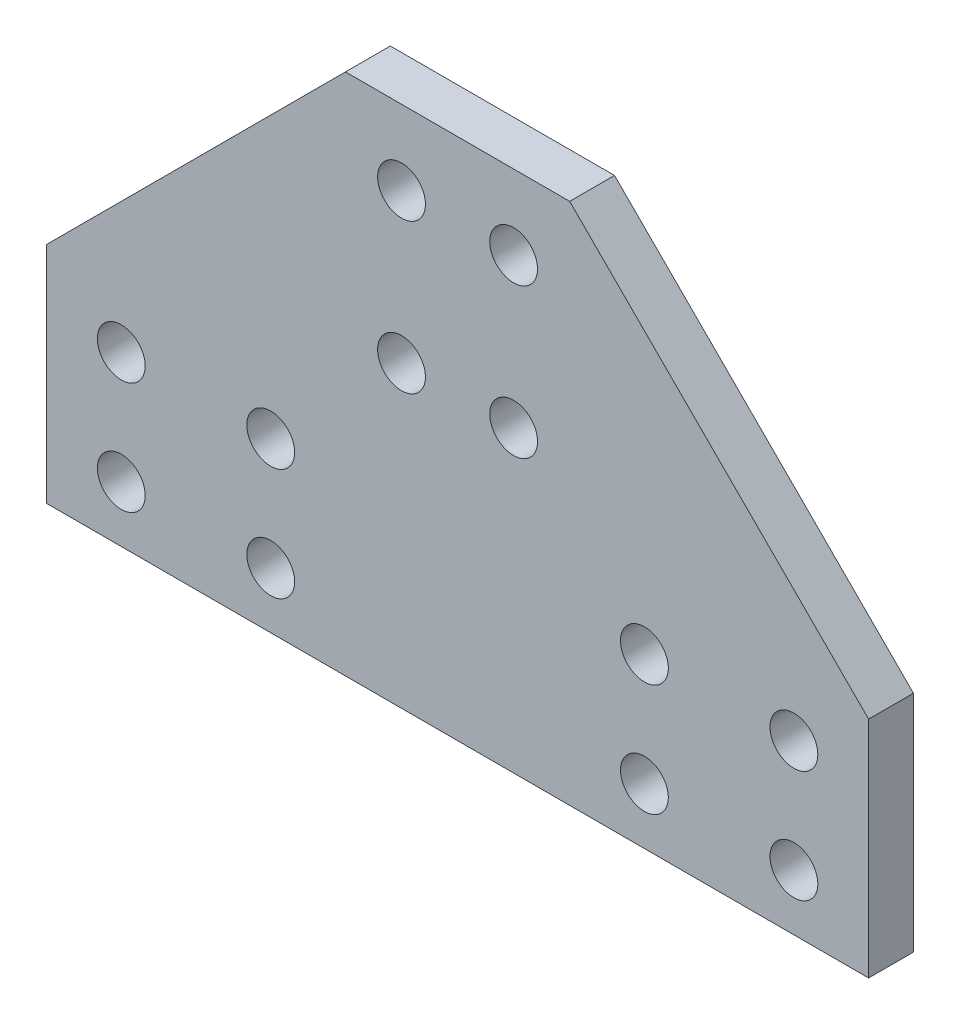
ISO-10303-21;
HEADER;
FILE_DESCRIPTION(('STEP AP214'),'2;1');
FILE_NAME('part.step','',(''),(''),'','','');
FILE_SCHEMA(('AUTOMOTIVE_DESIGN { 1 0 10303 214 1 1 1 1 }'));
ENDSEC;
DATA;
#1=APPLICATION_CONTEXT('core data for automotive mechanical design processes');
#2=APPLICATION_PROTOCOL_DEFINITION('international standard','automotive_design',2000,#1);
#3=PRODUCT_CONTEXT('',#1,'mechanical');
#4=PRODUCT('Part','Part','',(#3));
#5=PRODUCT_RELATED_PRODUCT_CATEGORY('part','',(#4));
#6=PRODUCT_DEFINITION_FORMATION('','',#4);
#7=PRODUCT_DEFINITION_CONTEXT('part definition',#1,'design');
#8=PRODUCT_DEFINITION('design','',#6,#7);
#9=PRODUCT_DEFINITION_SHAPE('','',#8);
#10=(LENGTH_UNIT() NAMED_UNIT(*) SI_UNIT(.MILLI.,.METRE.));
#11=(NAMED_UNIT(*) PLANE_ANGLE_UNIT() SI_UNIT($,.RADIAN.));
#12=(NAMED_UNIT(*) SI_UNIT($,.STERADIAN.) SOLID_ANGLE_UNIT());
#13=UNCERTAINTY_MEASURE_WITH_UNIT(LENGTH_MEASURE(1.E-05),#10,'distance_accuracy_value','');
#14=(GEOMETRIC_REPRESENTATION_CONTEXT(3) GLOBAL_UNCERTAINTY_ASSIGNED_CONTEXT((#13)) GLOBAL_UNIT_ASSIGNED_CONTEXT((#10,
#11,#12)) REPRESENTATION_CONTEXT('',''));
#15=CARTESIAN_POINT('',(0.,0.,0.));
#16=DIRECTION('',(0.,0.,1.));
#17=DIRECTION('',(1.,0.,0.));
#18=AXIS2_PLACEMENT_3D('',#15,#16,#17);
#19=CARTESIAN_POINT('',(-20.,-20.,3.));
#20=DIRECTION('',(0.707106781186548,-0.707106781186547,0.));
#21=DIRECTION('',(0.707106781186547,0.707106781186548,0.));
#22=AXIS2_PLACEMENT_3D('',#19,#20,#21);
#23=PLANE('',#22);
#24=DIRECTION('',(-0.707106781186547,-0.707106781186548,0.));
#25=VECTOR('',#24,1.);
#26=CARTESIAN_POINT('',(-20.,-20.,0.));
#27=LINE('',#26,#25);
#28=CARTESIAN_POINT('',(0.,0.,0.));
#29=VERTEX_POINT('',#28);
#30=CARTESIAN_POINT('',(-20.,-20.,0.));
#31=VERTEX_POINT('',#30);
#32=EDGE_CURVE('E132',#29,#31,#27,.T.);
#33=ORIENTED_EDGE('',*,*,#32,.T.);
#34=DIRECTION('',(0.,0.,-1.));
#35=VECTOR('',#34,1.);
#36=CARTESIAN_POINT('',(-20.,-20.,3.));
#37=LINE('',#36,#35);
#38=CARTESIAN_POINT('',(-20.,-20.,3.));
#39=VERTEX_POINT('',#38);
#40=EDGE_CURVE('E11',#39,#31,#37,.T.);
#41=ORIENTED_EDGE('',*,*,#40,.F.);
#42=DIRECTION('',(-0.707106781186547,-0.707106781186548,0.));
#43=VECTOR('',#42,1.);
#44=CARTESIAN_POINT('',(-20.,-20.,3.));
#45=LINE('',#44,#43);
#46=CARTESIAN_POINT('',(0.,0.,3.));
#47=VERTEX_POINT('',#46);
#48=EDGE_CURVE('E149',#47,#39,#45,.T.);
#49=ORIENTED_EDGE('',*,*,#48,.F.);
#50=DIRECTION('',(0.,0.,-1.));
#51=VECTOR('',#50,1.);
#52=CARTESIAN_POINT('',(0.,0.,3.));
#53=LINE('',#52,#51);
#54=EDGE_CURVE('E128',#47,#29,#53,.T.);
#55=ORIENTED_EDGE('',*,*,#54,.T.);
#56=EDGE_LOOP('',(#33,#41,#49,#55));
#57=FACE_BOUND('',#56,.T.);
#58=ADVANCED_FACE('F43',(#57),#23,.F.);
#59=CARTESIAN_POINT('',(-20.,-35.,3.));
#60=DIRECTION('',(1.,0.,0.));
#61=DIRECTION('',(0.,0.,-1.));
#62=AXIS2_PLACEMENT_3D('',#59,#60,#61);
#63=PLANE('',#62);
#64=DIRECTION('',(0.,-1.,0.));
#65=VECTOR('',#64,1.);
#66=CARTESIAN_POINT('',(-20.,-35.,0.));
#67=LINE('',#66,#65);
#68=CARTESIAN_POINT('',(-20.,-35.,0.));
#69=VERTEX_POINT('',#68);
#70=EDGE_CURVE('E136',#31,#69,#67,.T.);
#71=ORIENTED_EDGE('',*,*,#70,.T.);
#72=DIRECTION('',(0.,0.,-1.));
#73=VECTOR('',#72,1.);
#74=CARTESIAN_POINT('',(-20.,-35.,3.));
#75=LINE('',#74,#73);
#76=CARTESIAN_POINT('',(-20.,-35.,3.));
#77=VERTEX_POINT('',#76);
#78=EDGE_CURVE('E52',#77,#69,#75,.T.);
#79=ORIENTED_EDGE('',*,*,#78,.F.);
#80=DIRECTION('',(0.,-1.,0.));
#81=VECTOR('',#80,1.);
#82=CARTESIAN_POINT('',(-20.,-35.,3.));
#83=LINE('',#82,#81);
#84=EDGE_CURVE('E97',#39,#77,#83,.T.);
#85=ORIENTED_EDGE('',*,*,#84,.F.);
#86=ORIENTED_EDGE('',*,*,#40,.T.);
#87=EDGE_LOOP('',(#71,#79,#85,#86));
#88=FACE_BOUND('',#87,.T.);
#89=ADVANCED_FACE('F178',(#88),#63,.F.);
#90=CARTESIAN_POINT('',(35.,-35.,3.));
#91=DIRECTION('',(0.,1.,0.));
#92=DIRECTION('',(-1.,0.,0.));
#93=AXIS2_PLACEMENT_3D('',#90,#91,#92);
#94=PLANE('',#93);
#95=DIRECTION('',(1.,0.,0.));
#96=VECTOR('',#95,1.);
#97=CARTESIAN_POINT('',(35.,-35.,0.));
#98=LINE('',#97,#96);
#99=CARTESIAN_POINT('',(35.,-35.,0.));
#100=VERTEX_POINT('',#99);
#101=EDGE_CURVE('E140',#69,#100,#98,.T.);
#102=ORIENTED_EDGE('',*,*,#101,.T.);
#103=DIRECTION('',(0.,0.,-1.));
#104=VECTOR('',#103,1.);
#105=CARTESIAN_POINT('',(35.,-35.,3.));
#106=LINE('',#105,#104);
#107=CARTESIAN_POINT('',(35.,-35.,3.));
#108=VERTEX_POINT('',#107);
#109=EDGE_CURVE('E121',#108,#100,#106,.T.);
#110=ORIENTED_EDGE('',*,*,#109,.F.);
#111=DIRECTION('',(1.,0.,0.));
#112=VECTOR('',#111,1.);
#113=CARTESIAN_POINT('',(35.,-35.,3.));
#114=LINE('',#113,#112);
#115=EDGE_CURVE('E110',#77,#108,#114,.T.);
#116=ORIENTED_EDGE('',*,*,#115,.F.);
#117=ORIENTED_EDGE('',*,*,#78,.T.);
#118=EDGE_LOOP('',(#102,#110,#116,#117));
#119=FACE_BOUND('',#118,.T.);
#120=ADVANCED_FACE('F159',(#119),#94,.F.);
#121=CARTESIAN_POINT('',(35.,-20.,3.));
#122=DIRECTION('',(-1.,0.,0.));
#123=DIRECTION('',(0.,0.,1.));
#124=AXIS2_PLACEMENT_3D('',#121,#122,#123);
#125=PLANE('',#124);
#126=DIRECTION('',(0.,1.,0.));
#127=VECTOR('',#126,1.);
#128=CARTESIAN_POINT('',(35.,-20.,0.));
#129=LINE('',#128,#127);
#130=CARTESIAN_POINT('',(35.,-20.,0.));
#131=VERTEX_POINT('',#130);
#132=EDGE_CURVE('E119',#100,#131,#129,.T.);
#133=ORIENTED_EDGE('',*,*,#132,.T.);
#134=DIRECTION('',(0.,0.,-1.));
#135=VECTOR('',#134,1.);
#136=CARTESIAN_POINT('',(35.,-20.,3.));
#137=LINE('',#136,#135);
#138=CARTESIAN_POINT('',(35.,-20.,3.));
#139=VERTEX_POINT('',#138);
#140=EDGE_CURVE('E116',#139,#131,#137,.T.);
#141=ORIENTED_EDGE('',*,*,#140,.F.);
#142=DIRECTION('',(0.,1.,0.));
#143=VECTOR('',#142,1.);
#144=CARTESIAN_POINT('',(35.,-20.,3.));
#145=LINE('',#144,#143);
#146=EDGE_CURVE('E104',#108,#139,#145,.T.);
#147=ORIENTED_EDGE('',*,*,#146,.F.);
#148=ORIENTED_EDGE('',*,*,#109,.T.);
#149=EDGE_LOOP('',(#133,#141,#147,#148));
#150=FACE_BOUND('',#149,.T.);
#151=ADVANCED_FACE('F117',(#150),#125,.F.);
#152=CARTESIAN_POINT('',(15.,0.,3.));
#153=DIRECTION('',(-0.707106781186547,-0.707106781186548,0.));
#154=DIRECTION('',(0.707106781186548,-0.707106781186547,0.));
#155=AXIS2_PLACEMENT_3D('',#152,#153,#154);
#156=PLANE('',#155);
#157=DIRECTION('',(-0.707106781186548,0.707106781186547,0.));
#158=VECTOR('',#157,1.);
#159=CARTESIAN_POINT('',(15.,0.,0.));
#160=LINE('',#159,#158);
#161=CARTESIAN_POINT('',(15.,0.,0.));
#162=VERTEX_POINT('',#161);
#163=EDGE_CURVE('E83',#131,#162,#160,.T.);
#164=ORIENTED_EDGE('',*,*,#163,.T.);
#165=DIRECTION('',(0.,0.,-1.));
#166=VECTOR('',#165,1.);
#167=CARTESIAN_POINT('',(15.,0.,3.));
#168=LINE('',#167,#166);
#169=CARTESIAN_POINT('',(15.,0.,3.));
#170=VERTEX_POINT('',#169);
#171=EDGE_CURVE('E122',#170,#162,#168,.T.);
#172=ORIENTED_EDGE('',*,*,#171,.F.);
#173=DIRECTION('',(-0.707106781186548,0.707106781186547,0.));
#174=VECTOR('',#173,1.);
#175=CARTESIAN_POINT('',(15.,0.,3.));
#176=LINE('',#175,#174);
#177=EDGE_CURVE('E108',#139,#170,#176,.T.);
#178=ORIENTED_EDGE('',*,*,#177,.F.);
#179=ORIENTED_EDGE('',*,*,#140,.T.);
#180=EDGE_LOOP('',(#164,#172,#178,#179));
#181=FACE_BOUND('',#180,.T.);
#182=ADVANCED_FACE('F124',(#181),#156,.F.);
#183=CARTESIAN_POINT('',(0.,0.,3.));
#184=DIRECTION('',(0.,-1.,0.));
#185=DIRECTION('',(1.,0.,0.));
#186=AXIS2_PLACEMENT_3D('',#183,#184,#185);
#187=PLANE('',#186);
#188=DIRECTION('',(-1.,0.,0.));
#189=VECTOR('',#188,1.);
#190=CARTESIAN_POINT('',(0.,0.,0.));
#191=LINE('',#190,#189);
#192=EDGE_CURVE('E89',#162,#29,#191,.T.);
#193=ORIENTED_EDGE('',*,*,#192,.T.);
#194=ORIENTED_EDGE('',*,*,#54,.F.);
#195=DIRECTION('',(-1.,0.,0.));
#196=VECTOR('',#195,1.);
#197=CARTESIAN_POINT('',(0.,0.,3.));
#198=LINE('',#197,#196);
#199=EDGE_CURVE('E60',#170,#47,#198,.T.);
#200=ORIENTED_EDGE('',*,*,#199,.F.);
#201=ORIENTED_EDGE('',*,*,#171,.T.);
#202=EDGE_LOOP('',(#193,#194,#200,#201));
#203=FACE_BOUND('',#202,.T.);
#204=ADVANCED_FACE('F166',(#203),#187,.F.);
#205=CARTESIAN_POINT('',(0.,0.,3.));
#206=DIRECTION('',(0.,0.,-1.));
#207=DIRECTION('',(-1.,0.,0.));
#208=AXIS2_PLACEMENT_3D('',#205,#206,#207);
#209=PLANE('',#208);
#210=CARTESIAN_POINT('',(30.,-31.25,3.));
#211=DIRECTION('',(0.,0.,1.));
#212=DIRECTION('',(-1.,0.,0.));
#213=AXIS2_PLACEMENT_3D('',#210,#211,#212);
#214=CIRCLE('',#213,1.6);
#215=CARTESIAN_POINT('',(28.4,-31.25,3.));
#216=VERTEX_POINT('',#215);
#217=EDGE_CURVE('E398',#216,#216,#214,.T.);
#218=ORIENTED_EDGE('',*,*,#217,.F.);
#219=EDGE_LOOP('',(#218));
#220=FACE_BOUND('',#219,.T.);
#221=CARTESIAN_POINT('',(20.,-23.75,3.));
#222=DIRECTION('',(0.,0.,1.));
#223=DIRECTION('',(-1.,0.,0.));
#224=AXIS2_PLACEMENT_3D('',#221,#222,#223);
#225=CIRCLE('',#224,1.6);
#226=CARTESIAN_POINT('',(18.4,-23.75,3.));
#227=VERTEX_POINT('',#226);
#228=EDGE_CURVE('E407',#227,#227,#225,.T.);
#229=ORIENTED_EDGE('',*,*,#228,.F.);
#230=EDGE_LOOP('',(#229));
#231=FACE_BOUND('',#230,.T.);
#232=CARTESIAN_POINT('',(30.,-23.75,3.));
#233=DIRECTION('',(0.,0.,1.));
#234=DIRECTION('',(1.,0.,0.));
#235=AXIS2_PLACEMENT_3D('',#232,#233,#234);
#236=CIRCLE('',#235,1.6);
#237=CARTESIAN_POINT('',(31.6,-23.75,3.));
#238=VERTEX_POINT('',#237);
#239=EDGE_CURVE('E420',#238,#238,#236,.T.);
#240=ORIENTED_EDGE('',*,*,#239,.F.);
#241=EDGE_LOOP('',(#240));
#242=FACE_BOUND('',#241,.T.);
#243=CARTESIAN_POINT('',(3.75,-5.,3.));
#244=DIRECTION('',(0.,0.,1.));
#245=DIRECTION('',(1.,0.,0.));
#246=AXIS2_PLACEMENT_3D('',#243,#244,#245);
#247=CIRCLE('',#246,1.6);
#248=CARTESIAN_POINT('',(5.35,-5.,3.));
#249=VERTEX_POINT('',#248);
#250=EDGE_CURVE('E505',#249,#249,#247,.T.);
#251=ORIENTED_EDGE('',*,*,#250,.F.);
#252=EDGE_LOOP('',(#251));
#253=FACE_BOUND('',#252,.T.);
#254=CARTESIAN_POINT('',(-15.,-23.75,3.));
#255=DIRECTION('',(0.,0.,1.));
#256=DIRECTION('',(-1.,0.,0.));
#257=AXIS2_PLACEMENT_3D('',#254,#255,#256);
#258=CIRCLE('',#257,1.6);
#259=CARTESIAN_POINT('',(-16.6,-23.75,3.));
#260=VERTEX_POINT('',#259);
#261=EDGE_CURVE('E433',#260,#260,#258,.T.);
#262=ORIENTED_EDGE('',*,*,#261,.F.);
#263=EDGE_LOOP('',(#262));
#264=FACE_BOUND('',#263,.T.);
#265=CARTESIAN_POINT('',(-4.99999999999999,-31.25,3.));
#266=DIRECTION('',(0.,0.,1.));
#267=DIRECTION('',(-1.,0.,0.));
#268=AXIS2_PLACEMENT_3D('',#265,#266,#267);
#269=CIRCLE('',#268,1.6);
#270=CARTESIAN_POINT('',(-6.59999999999999,-31.25,3.));
#271=VERTEX_POINT('',#270);
#272=EDGE_CURVE('E442',#271,#271,#269,.T.);
#273=ORIENTED_EDGE('',*,*,#272,.F.);
#274=EDGE_LOOP('',(#273));
#275=FACE_BOUND('',#274,.T.);
#276=CARTESIAN_POINT('',(-5.,-23.75,3.));
#277=DIRECTION('',(0.,0.,1.));
#278=DIRECTION('',(1.,0.,0.));
#279=AXIS2_PLACEMENT_3D('',#276,#277,#278);
#280=CIRCLE('',#279,1.6);
#281=CARTESIAN_POINT('',(-3.4,-23.75,3.));
#282=VERTEX_POINT('',#281);
#283=EDGE_CURVE('E421',#282,#282,#280,.T.);
#284=ORIENTED_EDGE('',*,*,#283,.F.);
#285=EDGE_LOOP('',(#284));
#286=FACE_BOUND('',#285,.T.);
#287=CARTESIAN_POINT('',(20.,-31.25,3.));
#288=DIRECTION('',(0.,0.,1.));
#289=DIRECTION('',(1.,0.,0.));
#290=AXIS2_PLACEMENT_3D('',#287,#288,#289);
#291=CIRCLE('',#290,1.59999999999999);
#292=CARTESIAN_POINT('',(21.6,-31.25,3.));
#293=VERTEX_POINT('',#292);
#294=EDGE_CURVE('E405',#293,#293,#291,.T.);
#295=ORIENTED_EDGE('',*,*,#294,.F.);
#296=EDGE_LOOP('',(#295));
#297=FACE_BOUND('',#296,.T.);
#298=CARTESIAN_POINT('',(11.25,-5.,3.));
#299=DIRECTION('',(0.,0.,1.));
#300=DIRECTION('',(-1.,0.,0.));
#301=AXIS2_PLACEMENT_3D('',#298,#299,#300);
#302=CIRCLE('',#301,1.6);
#303=CARTESIAN_POINT('',(9.65,-5.,3.));
#304=VERTEX_POINT('',#303);
#305=EDGE_CURVE('E478',#304,#304,#302,.T.);
#306=ORIENTED_EDGE('',*,*,#305,.F.);
#307=EDGE_LOOP('',(#306));
#308=FACE_BOUND('',#307,.T.);
#309=CARTESIAN_POINT('',(11.25,-15.,3.));
#310=DIRECTION('',(0.,0.,1.));
#311=DIRECTION('',(1.,0.,0.));
#312=AXIS2_PLACEMENT_3D('',#309,#310,#311);
#313=CIRCLE('',#312,1.6);
#314=CARTESIAN_POINT('',(12.85,-15.,3.));
#315=VERTEX_POINT('',#314);
#316=EDGE_CURVE('E482',#315,#315,#313,.T.);
#317=ORIENTED_EDGE('',*,*,#316,.F.);
#318=EDGE_LOOP('',(#317));
#319=FACE_BOUND('',#318,.T.);
#320=CARTESIAN_POINT('',(3.75,-15.,3.));
#321=DIRECTION('',(0.,0.,1.));
#322=DIRECTION('',(-1.,0.,0.));
#323=AXIS2_PLACEMENT_3D('',#320,#321,#322);
#324=CIRCLE('',#323,1.6);
#325=CARTESIAN_POINT('',(2.15,-15.,3.));
#326=VERTEX_POINT('',#325);
#327=EDGE_CURVE('E485',#326,#326,#324,.T.);
#328=ORIENTED_EDGE('',*,*,#327,.F.);
#329=EDGE_LOOP('',(#328));
#330=FACE_BOUND('',#329,.T.);
#331=CARTESIAN_POINT('',(-15.,-31.25,3.));
#332=DIRECTION('',(0.,0.,1.));
#333=DIRECTION('',(1.,0.,0.));
#334=AXIS2_PLACEMENT_3D('',#331,#332,#333);
#335=CIRCLE('',#334,1.6);
#336=CARTESIAN_POINT('',(-13.4,-31.25,3.));
#337=VERTEX_POINT('',#336);
#338=EDGE_CURVE('E437',#337,#337,#335,.T.);
#339=ORIENTED_EDGE('',*,*,#338,.F.);
#340=EDGE_LOOP('',(#339));
#341=FACE_BOUND('',#340,.T.);
#342=ORIENTED_EDGE('',*,*,#48,.T.);
#343=ORIENTED_EDGE('',*,*,#84,.T.);
#344=ORIENTED_EDGE('',*,*,#115,.T.);
#345=ORIENTED_EDGE('',*,*,#146,.T.);
#346=ORIENTED_EDGE('',*,*,#177,.T.);
#347=ORIENTED_EDGE('',*,*,#199,.T.);
#348=EDGE_LOOP('',(#342,#343,#344,#345,#346,#347));
#349=FACE_BOUND('',#348,.T.);
#350=ADVANCED_FACE('F106',(#220,#231,#242,#253,#264,#275,#286,#297,#308,#319,#330,#341,#349),
#209,.F.);
#351=CARTESIAN_POINT('',(0.,0.,0.));
#352=DIRECTION('',(0.,0.,-1.));
#353=DIRECTION('',(-1.,0.,0.));
#354=AXIS2_PLACEMENT_3D('',#351,#352,#353);
#355=PLANE('',#354);
#356=CARTESIAN_POINT('',(30.,-31.25,0.));
#357=DIRECTION('',(0.,0.,1.));
#358=DIRECTION('',(-1.,0.,0.));
#359=AXIS2_PLACEMENT_3D('',#356,#357,#358);
#360=CIRCLE('',#359,1.6);
#361=CARTESIAN_POINT('',(28.4,-31.25,0.));
#362=VERTEX_POINT('',#361);
#363=EDGE_CURVE('E395',#362,#362,#360,.T.);
#364=ORIENTED_EDGE('',*,*,#363,.T.);
#365=EDGE_LOOP('',(#364));
#366=FACE_BOUND('',#365,.T.);
#367=CARTESIAN_POINT('',(20.,-23.75,0.));
#368=DIRECTION('',(0.,0.,1.));
#369=DIRECTION('',(-1.,0.,0.));
#370=AXIS2_PLACEMENT_3D('',#367,#368,#369);
#371=CIRCLE('',#370,1.6);
#372=CARTESIAN_POINT('',(18.4,-23.75,0.));
#373=VERTEX_POINT('',#372);
#374=EDGE_CURVE('E416',#373,#373,#371,.T.);
#375=ORIENTED_EDGE('',*,*,#374,.T.);
#376=EDGE_LOOP('',(#375));
#377=FACE_BOUND('',#376,.T.);
#378=CARTESIAN_POINT('',(30.,-23.75,0.));
#379=DIRECTION('',(0.,0.,1.));
#380=DIRECTION('',(1.,0.,0.));
#381=AXIS2_PLACEMENT_3D('',#378,#379,#380);
#382=CIRCLE('',#381,1.6);
#383=CARTESIAN_POINT('',(31.6,-23.75,0.));
#384=VERTEX_POINT('',#383);
#385=EDGE_CURVE('E502',#384,#384,#382,.T.);
#386=ORIENTED_EDGE('',*,*,#385,.T.);
#387=EDGE_LOOP('',(#386));
#388=FACE_BOUND('',#387,.T.);
#389=CARTESIAN_POINT('',(3.75,-5.,0.));
#390=DIRECTION('',(0.,0.,1.));
#391=DIRECTION('',(1.,0.,0.));
#392=AXIS2_PLACEMENT_3D('',#389,#390,#391);
#393=CIRCLE('',#392,1.6);
#394=CARTESIAN_POINT('',(5.35,-5.,0.));
#395=VERTEX_POINT('',#394);
#396=EDGE_CURVE('E410',#395,#395,#393,.T.);
#397=ORIENTED_EDGE('',*,*,#396,.T.);
#398=EDGE_LOOP('',(#397));
#399=FACE_BOUND('',#398,.T.);
#400=CARTESIAN_POINT('',(-15.,-23.75,0.));
#401=DIRECTION('',(0.,0.,1.));
#402=DIRECTION('',(-1.,0.,0.));
#403=AXIS2_PLACEMENT_3D('',#400,#401,#402);
#404=CIRCLE('',#403,1.6);
#405=CARTESIAN_POINT('',(-16.6,-23.75,0.));
#406=VERTEX_POINT('',#405);
#407=EDGE_CURVE('E438',#406,#406,#404,.T.);
#408=ORIENTED_EDGE('',*,*,#407,.T.);
#409=EDGE_LOOP('',(#408));
#410=FACE_BOUND('',#409,.T.);
#411=CARTESIAN_POINT('',(-4.99999999999999,-31.25,0.));
#412=DIRECTION('',(0.,0.,1.));
#413=DIRECTION('',(-1.,0.,0.));
#414=AXIS2_PLACEMENT_3D('',#411,#412,#413);
#415=CIRCLE('',#414,1.6);
#416=CARTESIAN_POINT('',(-6.59999999999999,-31.25,0.));
#417=VERTEX_POINT('',#416);
#418=EDGE_CURVE('E425',#417,#417,#415,.T.);
#419=ORIENTED_EDGE('',*,*,#418,.T.);
#420=EDGE_LOOP('',(#419));
#421=FACE_BOUND('',#420,.T.);
#422=CARTESIAN_POINT('',(-5.,-23.75,0.));
#423=DIRECTION('',(0.,0.,1.));
#424=DIRECTION('',(1.,0.,0.));
#425=AXIS2_PLACEMENT_3D('',#422,#423,#424);
#426=CIRCLE('',#425,1.6);
#427=CARTESIAN_POINT('',(-3.4,-23.75,0.));
#428=VERTEX_POINT('',#427);
#429=EDGE_CURVE('E426',#428,#428,#426,.T.);
#430=ORIENTED_EDGE('',*,*,#429,.T.);
#431=EDGE_LOOP('',(#430));
#432=FACE_BOUND('',#431,.T.);
#433=CARTESIAN_POINT('',(20.,-31.25,0.));
#434=DIRECTION('',(0.,0.,1.));
#435=DIRECTION('',(1.,0.,0.));
#436=AXIS2_PLACEMENT_3D('',#433,#434,#435);
#437=CIRCLE('',#436,1.59999999999999);
#438=CARTESIAN_POINT('',(21.6,-31.25,0.));
#439=VERTEX_POINT('',#438);
#440=EDGE_CURVE('E400',#439,#439,#437,.T.);
#441=ORIENTED_EDGE('',*,*,#440,.T.);
#442=EDGE_LOOP('',(#441));
#443=FACE_BOUND('',#442,.T.);
#444=CARTESIAN_POINT('',(11.25,-5.,0.));
#445=DIRECTION('',(0.,0.,1.));
#446=DIRECTION('',(-1.,0.,0.));
#447=AXIS2_PLACEMENT_3D('',#444,#445,#446);
#448=CIRCLE('',#447,1.6);
#449=CARTESIAN_POINT('',(9.65,-5.,0.));
#450=VERTEX_POINT('',#449);
#451=EDGE_CURVE('E515',#450,#450,#448,.T.);
#452=ORIENTED_EDGE('',*,*,#451,.T.);
#453=EDGE_LOOP('',(#452));
#454=FACE_BOUND('',#453,.T.);
#455=CARTESIAN_POINT('',(11.25,-15.,0.));
#456=DIRECTION('',(0.,0.,1.));
#457=DIRECTION('',(1.,0.,0.));
#458=AXIS2_PLACEMENT_3D('',#455,#456,#457);
#459=CIRCLE('',#458,1.6);
#460=CARTESIAN_POINT('',(12.85,-15.,0.));
#461=VERTEX_POINT('',#460);
#462=EDGE_CURVE('E488',#461,#461,#459,.T.);
#463=ORIENTED_EDGE('',*,*,#462,.T.);
#464=EDGE_LOOP('',(#463));
#465=FACE_BOUND('',#464,.T.);
#466=CARTESIAN_POINT('',(3.75,-15.,0.));
#467=DIRECTION('',(0.,0.,1.));
#468=DIRECTION('',(-1.,0.,0.));
#469=AXIS2_PLACEMENT_3D('',#466,#467,#468);
#470=CIRCLE('',#469,1.6);
#471=CARTESIAN_POINT('',(2.15,-15.,0.));
#472=VERTEX_POINT('',#471);
#473=EDGE_CURVE('E489',#472,#472,#470,.T.);
#474=ORIENTED_EDGE('',*,*,#473,.T.);
#475=EDGE_LOOP('',(#474));
#476=FACE_BOUND('',#475,.T.);
#477=CARTESIAN_POINT('',(-15.,-31.25,0.));
#478=DIRECTION('',(0.,0.,1.));
#479=DIRECTION('',(1.,0.,0.));
#480=AXIS2_PLACEMENT_3D('',#477,#478,#479);
#481=CIRCLE('',#480,1.6);
#482=CARTESIAN_POINT('',(-13.4,-31.25,0.));
#483=VERTEX_POINT('',#482);
#484=EDGE_CURVE('E137',#483,#483,#481,.T.);
#485=ORIENTED_EDGE('',*,*,#484,.T.);
#486=EDGE_LOOP('',(#485));
#487=FACE_BOUND('',#486,.T.);
#488=ORIENTED_EDGE('',*,*,#32,.F.);
#489=ORIENTED_EDGE('',*,*,#192,.F.);
#490=ORIENTED_EDGE('',*,*,#163,.F.);
#491=ORIENTED_EDGE('',*,*,#132,.F.);
#492=ORIENTED_EDGE('',*,*,#101,.F.);
#493=ORIENTED_EDGE('',*,*,#70,.F.);
#494=EDGE_LOOP('',(#488,#489,#490,#491,#492,#493));
#495=FACE_BOUND('',#494,.T.);
#496=ADVANCED_FACE('F162',(#366,#377,#388,#399,#410,#421,#432,#443,#454,#465,#476,#487,#495),
#355,.T.);
#497=CARTESIAN_POINT('',(-15.,-31.25,0.));
#498=DIRECTION('',(0.,0.,1.));
#499=DIRECTION('',(1.,0.,0.));
#500=AXIS2_PLACEMENT_3D('',#497,#498,#499);
#501=CYLINDRICAL_SURFACE('',#500,1.6);
#502=ORIENTED_EDGE('',*,*,#484,.F.);
#503=EDGE_LOOP('',(#502));
#504=FACE_BOUND('',#503,.T.);
#505=ORIENTED_EDGE('',*,*,#338,.T.);
#506=EDGE_LOOP('',(#505));
#507=FACE_BOUND('',#506,.T.);
#508=ADVANCED_FACE('F218',(#504,#507),#501,.F.);
#509=CARTESIAN_POINT('',(3.75,-15.,0.));
#510=DIRECTION('',(0.,0.,1.));
#511=DIRECTION('',(1.,0.,0.));
#512=AXIS2_PLACEMENT_3D('',#509,#510,#511);
#513=CYLINDRICAL_SURFACE('',#512,1.6);
#514=ORIENTED_EDGE('',*,*,#473,.F.);
#515=EDGE_LOOP('',(#514));
#516=FACE_BOUND('',#515,.T.);
#517=ORIENTED_EDGE('',*,*,#327,.T.);
#518=EDGE_LOOP('',(#517));
#519=FACE_BOUND('',#518,.T.);
#520=ADVANCED_FACE('F228',(#516,#519),#513,.F.);
#521=CARTESIAN_POINT('',(11.25,-15.,0.));
#522=DIRECTION('',(0.,0.,1.));
#523=DIRECTION('',(1.,0.,0.));
#524=AXIS2_PLACEMENT_3D('',#521,#522,#523);
#525=CYLINDRICAL_SURFACE('',#524,1.6);
#526=ORIENTED_EDGE('',*,*,#462,.F.);
#527=EDGE_LOOP('',(#526));
#528=FACE_BOUND('',#527,.T.);
#529=ORIENTED_EDGE('',*,*,#316,.T.);
#530=EDGE_LOOP('',(#529));
#531=FACE_BOUND('',#530,.T.);
#532=ADVANCED_FACE('F239',(#528,#531),#525,.F.);
#533=CARTESIAN_POINT('',(11.25,-5.,0.));
#534=DIRECTION('',(0.,0.,1.));
#535=DIRECTION('',(1.,0.,0.));
#536=AXIS2_PLACEMENT_3D('',#533,#534,#535);
#537=CYLINDRICAL_SURFACE('',#536,1.6);
#538=ORIENTED_EDGE('',*,*,#451,.F.);
#539=EDGE_LOOP('',(#538));
#540=FACE_BOUND('',#539,.T.);
#541=ORIENTED_EDGE('',*,*,#305,.T.);
#542=EDGE_LOOP('',(#541));
#543=FACE_BOUND('',#542,.T.);
#544=ADVANCED_FACE('F250',(#540,#543),#537,.F.);
#545=CARTESIAN_POINT('',(20.,-31.25,0.));
#546=DIRECTION('',(0.,0.,1.));
#547=DIRECTION('',(1.,0.,0.));
#548=AXIS2_PLACEMENT_3D('',#545,#546,#547);
#549=CYLINDRICAL_SURFACE('',#548,1.59999999999999);
#550=ORIENTED_EDGE('',*,*,#440,.F.);
#551=EDGE_LOOP('',(#550));
#552=FACE_BOUND('',#551,.T.);
#553=ORIENTED_EDGE('',*,*,#294,.T.);
#554=EDGE_LOOP('',(#553));
#555=FACE_BOUND('',#554,.T.);
#556=ADVANCED_FACE('F261',(#552,#555),#549,.F.);
#557=CARTESIAN_POINT('',(-5.,-23.75,0.));
#558=DIRECTION('',(0.,0.,1.));
#559=DIRECTION('',(1.,0.,0.));
#560=AXIS2_PLACEMENT_3D('',#557,#558,#559);
#561=CYLINDRICAL_SURFACE('',#560,1.6);
#562=ORIENTED_EDGE('',*,*,#429,.F.);
#563=EDGE_LOOP('',(#562));
#564=FACE_BOUND('',#563,.T.);
#565=ORIENTED_EDGE('',*,*,#283,.T.);
#566=EDGE_LOOP('',(#565));
#567=FACE_BOUND('',#566,.T.);
#568=ADVANCED_FACE('F272',(#564,#567),#561,.F.);
#569=CARTESIAN_POINT('',(-4.99999999999999,-31.25,0.));
#570=DIRECTION('',(0.,0.,1.));
#571=DIRECTION('',(1.,0.,0.));
#572=AXIS2_PLACEMENT_3D('',#569,#570,#571);
#573=CYLINDRICAL_SURFACE('',#572,1.6);
#574=ORIENTED_EDGE('',*,*,#418,.F.);
#575=EDGE_LOOP('',(#574));
#576=FACE_BOUND('',#575,.T.);
#577=ORIENTED_EDGE('',*,*,#272,.T.);
#578=EDGE_LOOP('',(#577));
#579=FACE_BOUND('',#578,.T.);
#580=ADVANCED_FACE('F283',(#576,#579),#573,.F.);
#581=CARTESIAN_POINT('',(-15.,-23.75,0.));
#582=DIRECTION('',(0.,0.,1.));
#583=DIRECTION('',(1.,0.,0.));
#584=AXIS2_PLACEMENT_3D('',#581,#582,#583);
#585=CYLINDRICAL_SURFACE('',#584,1.6);
#586=ORIENTED_EDGE('',*,*,#407,.F.);
#587=EDGE_LOOP('',(#586));
#588=FACE_BOUND('',#587,.T.);
#589=ORIENTED_EDGE('',*,*,#261,.T.);
#590=EDGE_LOOP('',(#589));
#591=FACE_BOUND('',#590,.T.);
#592=ADVANCED_FACE('F294',(#588,#591),#585,.F.);
#593=CARTESIAN_POINT('',(3.75,-5.,0.));
#594=DIRECTION('',(0.,0.,1.));
#595=DIRECTION('',(1.,0.,0.));
#596=AXIS2_PLACEMENT_3D('',#593,#594,#595);
#597=CYLINDRICAL_SURFACE('',#596,1.6);
#598=ORIENTED_EDGE('',*,*,#396,.F.);
#599=EDGE_LOOP('',(#598));
#600=FACE_BOUND('',#599,.T.);
#601=ORIENTED_EDGE('',*,*,#250,.T.);
#602=EDGE_LOOP('',(#601));
#603=FACE_BOUND('',#602,.T.);
#604=ADVANCED_FACE('F305',(#600,#603),#597,.F.);
#605=CARTESIAN_POINT('',(30.,-23.75,0.));
#606=DIRECTION('',(0.,0.,1.));
#607=DIRECTION('',(1.,0.,0.));
#608=AXIS2_PLACEMENT_3D('',#605,#606,#607);
#609=CYLINDRICAL_SURFACE('',#608,1.6);
#610=ORIENTED_EDGE('',*,*,#385,.F.);
#611=EDGE_LOOP('',(#610));
#612=FACE_BOUND('',#611,.T.);
#613=ORIENTED_EDGE('',*,*,#239,.T.);
#614=EDGE_LOOP('',(#613));
#615=FACE_BOUND('',#614,.T.);
#616=ADVANCED_FACE('F316',(#612,#615),#609,.F.);
#617=CARTESIAN_POINT('',(20.,-23.75,0.));
#618=DIRECTION('',(0.,0.,1.));
#619=DIRECTION('',(1.,0.,0.));
#620=AXIS2_PLACEMENT_3D('',#617,#618,#619);
#621=CYLINDRICAL_SURFACE('',#620,1.6);
#622=ORIENTED_EDGE('',*,*,#374,.F.);
#623=EDGE_LOOP('',(#622));
#624=FACE_BOUND('',#623,.T.);
#625=ORIENTED_EDGE('',*,*,#228,.T.);
#626=EDGE_LOOP('',(#625));
#627=FACE_BOUND('',#626,.T.);
#628=ADVANCED_FACE('F327',(#624,#627),#621,.F.);
#629=CARTESIAN_POINT('',(30.,-31.25,0.));
#630=DIRECTION('',(0.,0.,1.));
#631=DIRECTION('',(1.,0.,0.));
#632=AXIS2_PLACEMENT_3D('',#629,#630,#631);
#633=CYLINDRICAL_SURFACE('',#632,1.6);
#634=ORIENTED_EDGE('',*,*,#363,.F.);
#635=EDGE_LOOP('',(#634));
#636=FACE_BOUND('',#635,.T.);
#637=ORIENTED_EDGE('',*,*,#217,.T.);
#638=EDGE_LOOP('',(#637));
#639=FACE_BOUND('',#638,.T.);
#640=ADVANCED_FACE('F338',(#636,#639),#633,.F.);
#641=CLOSED_SHELL('',(#58,#89,#120,#151,#182,#204,#350,#496,#508,#520,#532,#544,#556,#568,#580,
#592,#604,#616,#628,#640));
#642=MANIFOLD_SOLID_BREP('B2',#641);
#643=ADVANCED_BREP_SHAPE_REPRESENTATION('',(#18,#642),#14);
#644=SHAPE_DEFINITION_REPRESENTATION(#9,#643);
ENDSEC;
END-ISO-10303-21;
